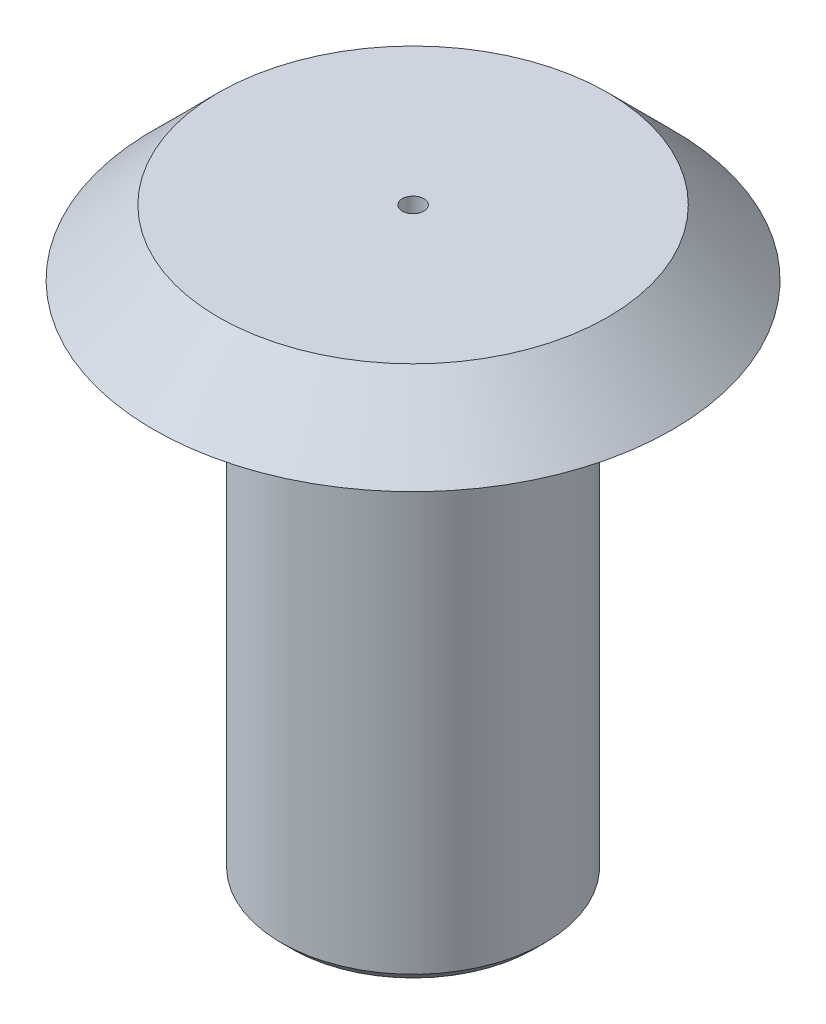
ISO-10303-21;
HEADER;
FILE_DESCRIPTION(('STEP AP214'),'2;1');
FILE_NAME('part.step','',(''),(''),'','','');
FILE_SCHEMA(('AUTOMOTIVE_DESIGN { 1 0 10303 214 1 1 1 1 }'));
ENDSEC;
DATA;
#1=APPLICATION_CONTEXT('core data for automotive mechanical design processes');
#2=APPLICATION_PROTOCOL_DEFINITION('international standard','automotive_design',2000,#1);
#3=PRODUCT_CONTEXT('',#1,'mechanical');
#4=PRODUCT('Part','Part','',(#3));
#5=PRODUCT_RELATED_PRODUCT_CATEGORY('part','',(#4));
#6=PRODUCT_DEFINITION_FORMATION('','',#4);
#7=PRODUCT_DEFINITION_CONTEXT('part definition',#1,'design');
#8=PRODUCT_DEFINITION('design','',#6,#7);
#9=PRODUCT_DEFINITION_SHAPE('','',#8);
#10=(LENGTH_UNIT() NAMED_UNIT(*) SI_UNIT(.MILLI.,.METRE.));
#11=(NAMED_UNIT(*) PLANE_ANGLE_UNIT() SI_UNIT($,.RADIAN.));
#12=(NAMED_UNIT(*) SI_UNIT($,.STERADIAN.) SOLID_ANGLE_UNIT());
#13=UNCERTAINTY_MEASURE_WITH_UNIT(LENGTH_MEASURE(1.E-05),#10,'distance_accuracy_value','');
#14=(GEOMETRIC_REPRESENTATION_CONTEXT(3) GLOBAL_UNCERTAINTY_ASSIGNED_CONTEXT((#13)) GLOBAL_UNIT_ASSIGNED_CONTEXT((#10,
#11,#12)) REPRESENTATION_CONTEXT('',''));
#15=CARTESIAN_POINT('',(0.,0.,0.));
#16=DIRECTION('',(0.,0.,1.));
#17=DIRECTION('',(1.,0.,0.));
#18=AXIS2_PLACEMENT_3D('',#15,#16,#17);
#19=CARTESIAN_POINT('',(12.,0.,0.));
#20=DIRECTION('',(0.,-1.,0.));
#21=DIRECTION('',(1.,0.,0.));
#22=AXIS2_PLACEMENT_3D('',#19,#20,#21);
#23=PLANE('',#22);
#24=CARTESIAN_POINT('',(0.,0.,0.));
#25=DIRECTION('',(0.,-1.,0.));
#26=DIRECTION('',(1.,0.,0.));
#27=AXIS2_PLACEMENT_3D('',#24,#25,#26);
#28=CIRCLE('',#27,12.);
#29=CARTESIAN_POINT('',(12.,0.,0.));
#30=VERTEX_POINT('',#29);
#31=EDGE_CURVE('E102',#30,#30,#28,.T.);
#32=ORIENTED_EDGE('',*,*,#31,.T.);
#33=EDGE_LOOP('',(#32));
#34=FACE_BOUND('',#33,.T.);
#35=CARTESIAN_POINT('',(0.,0.,0.));
#36=DIRECTION('',(0.,-1.,0.));
#37=DIRECTION('',(1.,0.,0.));
#38=AXIS2_PLACEMENT_3D('',#35,#36,#37);
#39=CIRCLE('',#38,9.);
#40=CARTESIAN_POINT('',(9.,0.,0.));
#41=VERTEX_POINT('',#40);
#42=EDGE_CURVE('E66',#41,#41,#39,.T.);
#43=ORIENTED_EDGE('',*,*,#42,.F.);
#44=EDGE_LOOP('',(#43));
#45=FACE_BOUND('',#44,.T.);
#46=ADVANCED_FACE('F39',(#34,#45),#23,.T.);
#47=CARTESIAN_POINT('',(0.,1.,0.));
#48=DIRECTION('',(0.,-1.,0.));
#49=DIRECTION('',(1.,0.,0.));
#50=AXIS2_PLACEMENT_3D('',#47,#48,#49);
#51=CONICAL_SURFACE('',#50,7.99999999999999,0.785398163397452);
#52=ORIENTED_EDGE('',*,*,#42,.T.);
#53=EDGE_LOOP('',(#52));
#54=FACE_BOUND('',#53,.T.);
#55=CARTESIAN_POINT('',(0.,1.,0.));
#56=DIRECTION('',(0.,-1.,0.));
#57=DIRECTION('',(1.,0.,0.));
#58=AXIS2_PLACEMENT_3D('',#55,#56,#57);
#59=CIRCLE('',#58,7.99999999999999);
#60=CARTESIAN_POINT('',(7.99999999999999,1.00000000000003,0.));
#61=VERTEX_POINT('',#60);
#62=EDGE_CURVE('E69',#61,#61,#59,.T.);
#63=ORIENTED_EDGE('',*,*,#62,.F.);
#64=EDGE_LOOP('',(#63));
#65=FACE_BOUND('',#64,.T.);
#66=ADVANCED_FACE('F126',(#54,#65),#51,.F.);
#67=CARTESIAN_POINT('',(7.99999999999999,1.,0.));
#68=DIRECTION('',(0.,-1.,0.));
#69=DIRECTION('',(1.,0.,0.));
#70=AXIS2_PLACEMENT_3D('',#67,#68,#69);
#71=PLANE('',#70);
#72=CARTESIAN_POINT('',(0.,0.999999999999977,0.));
#73=DIRECTION('',(0.,-1.,0.));
#74=DIRECTION('',(1.,0.,0.));
#75=AXIS2_PLACEMENT_3D('',#72,#73,#74);
#76=CIRCLE('',#75,6.59999999999994);
#77=CARTESIAN_POINT('',(6.59999999999994,0.999999999999999,0.));
#78=VERTEX_POINT('',#77);
#79=EDGE_CURVE('E10',#78,#78,#76,.F.);
#80=ORIENTED_EDGE('',*,*,#79,.T.);
#81=EDGE_LOOP('',(#80));
#82=FACE_BOUND('',#81,.T.);
#83=ORIENTED_EDGE('',*,*,#62,.T.);
#84=EDGE_LOOP('',(#83));
#85=FACE_BOUND('',#84,.T.);
#86=ADVANCED_FACE('F131',(#82,#85),#71,.T.);
#87=CARTESIAN_POINT('',(2.56415325894486E-12,-747.512282571255,0.));
#88=DIRECTION('',(0.,-1.,0.));
#89=DIRECTION('',(1.,0.,0.));
#90=AXIS2_PLACEMENT_3D('',#87,#88,#89);
#91=CYLINDRICAL_SURFACE('',#90,6.09999999999996);
#92=CARTESIAN_POINT('',(0.,-23.5,0.));
#93=DIRECTION('',(0.,-1.,0.));
#94=DIRECTION('',(1.,0.,0.));
#95=AXIS2_PLACEMENT_3D('',#92,#93,#94);
#96=CIRCLE('',#95,6.09999999999996);
#97=CARTESIAN_POINT('',(6.10000000000004,-23.4999999999999,0.));
#98=VERTEX_POINT('',#97);
#99=EDGE_CURVE('E47',#98,#98,#96,.F.);
#100=ORIENTED_EDGE('',*,*,#99,.T.);
#101=EDGE_LOOP('',(#100));
#102=FACE_BOUND('',#101,.T.);
#103=CARTESIAN_POINT('',(0.,0.499999999999945,0.));
#104=DIRECTION('',(0.,-1.,0.));
#105=DIRECTION('',(1.,0.,0.));
#106=AXIS2_PLACEMENT_3D('',#103,#104,#105);
#107=CIRCLE('',#106,6.09999999999996);
#108=CARTESIAN_POINT('',(6.09999999999996,0.499999999999966,0.));
#109=VERTEX_POINT('',#108);
#110=EDGE_CURVE('E51',#109,#109,#107,.T.);
#111=ORIENTED_EDGE('',*,*,#110,.T.);
#112=EDGE_LOOP('',(#111));
#113=FACE_BOUND('',#112,.T.);
#114=ADVANCED_FACE('F153',(#102,#113),#91,.T.);
#115=CARTESIAN_POINT('',(6.1,-24.,0.));
#116=DIRECTION('',(0.,-1.,0.));
#117=DIRECTION('',(1.,0.,0.));
#118=AXIS2_PLACEMENT_3D('',#115,#116,#117);
#119=PLANE('',#118);
#120=CARTESIAN_POINT('',(0.,-24.,0.));
#121=DIRECTION('',(0.,-1.,0.));
#122=DIRECTION('',(1.,0.,0.));
#123=AXIS2_PLACEMENT_3D('',#120,#121,#122);
#124=CIRCLE('',#123,1.49999999999996);
#125=CARTESIAN_POINT('',(1.50000000000004,-24.,0.));
#126=VERTEX_POINT('',#125);
#127=EDGE_CURVE('E55',#126,#126,#124,.F.);
#128=ORIENTED_EDGE('',*,*,#127,.T.);
#129=EDGE_LOOP('',(#128));
#130=FACE_BOUND('',#129,.T.);
#131=CARTESIAN_POINT('',(0.,-24.,0.));
#132=DIRECTION('',(0.,-1.,0.));
#133=DIRECTION('',(1.,0.,0.));
#134=AXIS2_PLACEMENT_3D('',#131,#132,#133);
#135=CIRCLE('',#134,5.59999999999999);
#136=CARTESIAN_POINT('',(5.60000000000007,-24.,0.));
#137=VERTEX_POINT('',#136);
#138=EDGE_CURVE('E60',#137,#137,#135,.T.);
#139=ORIENTED_EDGE('',*,*,#138,.T.);
#140=EDGE_LOOP('',(#139));
#141=FACE_BOUND('',#140,.T.);
#142=ADVANCED_FACE('F150',(#130,#141),#119,.T.);
#143=CARTESIAN_POINT('',(2.56415325894486E-12,-747.512282571255,0.));
#144=DIRECTION('',(0.,-1.,0.));
#145=DIRECTION('',(1.,0.,0.));
#146=AXIS2_PLACEMENT_3D('',#143,#144,#145);
#147=CYLINDRICAL_SURFACE('',#146,0.999999999999919);
#148=CARTESIAN_POINT('',(0.,-23.5,0.));
#149=DIRECTION('',(0.,-1.,0.));
#150=DIRECTION('',(1.,0.,0.));
#151=AXIS2_PLACEMENT_3D('',#148,#149,#150);
#152=CIRCLE('',#151,0.999999999999919);
#153=CARTESIAN_POINT('',(1.,-23.5,0.));
#154=VERTEX_POINT('',#153);
#155=EDGE_CURVE('E63',#154,#154,#152,.T.);
#156=ORIENTED_EDGE('',*,*,#155,.T.);
#157=EDGE_LOOP('',(#156));
#158=FACE_BOUND('',#157,.T.);
#159=CARTESIAN_POINT('',(0.,-23.1180339887465,0.));
#160=DIRECTION('',(0.,-1.,0.));
#161=DIRECTION('',(1.,0.,0.));
#162=AXIS2_PLACEMENT_3D('',#159,#160,#161);
#163=CIRCLE('',#162,0.99999999999992);
#164=CARTESIAN_POINT('',(1.,-23.1180339887465,0.));
#165=VERTEX_POINT('',#164);
#166=EDGE_CURVE('E72',#165,#165,#163,.T.);
#167=ORIENTED_EDGE('',*,*,#166,.F.);
#168=EDGE_LOOP('',(#167));
#169=FACE_BOUND('',#168,.T.);
#170=ADVANCED_FACE('F152',(#158,#169),#147,.F.);
#171=CARTESIAN_POINT('',(0.,-23.1180339887465,0.));
#172=DIRECTION('',(0.,-1.,0.));
#173=DIRECTION('',(1.,0.,0.));
#174=AXIS2_PLACEMENT_3D('',#171,#172,#173);
#175=SPHERICAL_SURFACE('',#174,1.);
#176=ORIENTED_EDGE('',*,*,#166,.T.);
#177=EDGE_LOOP('',(#176));
#178=FACE_BOUND('',#177,.T.);
#179=CARTESIAN_POINT('',(0.,-22.3726779962475,0.));
#180=DIRECTION('',(0.,-1.,0.));
#181=DIRECTION('',(1.,0.,0.));
#182=AXIS2_PLACEMENT_3D('',#179,#180,#181);
#183=CIRCLE('',#182,0.666666666667726);
#184=CARTESIAN_POINT('',(0.666666666667803,-22.3726779962475,0.));
#185=VERTEX_POINT('',#184);
#186=EDGE_CURVE('E75',#185,#185,#183,.T.);
#187=ORIENTED_EDGE('',*,*,#186,.F.);
#188=EDGE_LOOP('',(#187));
#189=FACE_BOUND('',#188,.T.);
#190=ADVANCED_FACE('F160',(#178,#189),#175,.F.);
#191=CARTESIAN_POINT('',(0.,-22.,0.));
#192=DIRECTION('',(0.,-1.,0.));
#193=DIRECTION('',(1.,0.,0.));
#194=AXIS2_PLACEMENT_3D('',#191,#192,#193);
#195=TOROIDAL_SURFACE('',#194,0.999999999999925,0.499999999997444);
#196=ORIENTED_EDGE('',*,*,#186,.T.);
#197=EDGE_LOOP('',(#196));
#198=FACE_BOUND('',#197,.T.);
#199=CARTESIAN_POINT('',(0.,-21.6273220037524,0.));
#200=DIRECTION('',(0.,-1.,0.));
#201=DIRECTION('',(1.,0.,0.));
#202=AXIS2_PLACEMENT_3D('',#199,#200,#201);
#203=CIRCLE('',#202,0.666666666667729);
#204=CARTESIAN_POINT('',(0.666666666667803,-21.6273220037524,0.));
#205=VERTEX_POINT('',#204);
#206=EDGE_CURVE('E78',#205,#205,#203,.T.);
#207=ORIENTED_EDGE('',*,*,#206,.F.);
#208=EDGE_LOOP('',(#207));
#209=FACE_BOUND('',#208,.T.);
#210=ADVANCED_FACE('F196',(#198,#209),#195,.T.);
#211=CARTESIAN_POINT('',(0.,-20.8819660112535,0.));
#212=DIRECTION('',(0.,-1.,0.));
#213=DIRECTION('',(1.,0.,0.));
#214=AXIS2_PLACEMENT_3D('',#211,#212,#213);
#215=SPHERICAL_SURFACE('',#214,1.);
#216=ORIENTED_EDGE('',*,*,#206,.T.);
#217=EDGE_LOOP('',(#216));
#218=FACE_BOUND('',#217,.T.);
#219=CARTESIAN_POINT('',(0.,-20.8819660112536,0.));
#220=DIRECTION('',(0.,-1.,0.));
#221=DIRECTION('',(1.,0.,0.));
#222=AXIS2_PLACEMENT_3D('',#219,#220,#221);
#223=CIRCLE('',#222,0.999999999999928);
#224=CARTESIAN_POINT('',(1.,-20.8819660112536,0.));
#225=VERTEX_POINT('',#224);
#226=EDGE_CURVE('E81',#225,#225,#223,.T.);
#227=ORIENTED_EDGE('',*,*,#226,.F.);
#228=EDGE_LOOP('',(#227));
#229=FACE_BOUND('',#228,.T.);
#230=ADVANCED_FACE('F205',(#218,#229),#215,.F.);
#231=CARTESIAN_POINT('',(2.56415325894486E-12,-747.512282571255,0.));
#232=DIRECTION('',(0.,-1.,0.));
#233=DIRECTION('',(1.,0.,0.));
#234=AXIS2_PLACEMENT_3D('',#231,#232,#233);
#235=CYLINDRICAL_SURFACE('',#234,1.00000000000042);
#236=ORIENTED_EDGE('',*,*,#226,.T.);
#237=EDGE_LOOP('',(#236));
#238=FACE_BOUND('',#237,.T.);
#239=CARTESIAN_POINT('',(0.,1.18933982822278,0.));
#240=DIRECTION('',(0.,-1.,0.));
#241=DIRECTION('',(1.,0.,0.));
#242=AXIS2_PLACEMENT_3D('',#239,#240,#241);
#243=CIRCLE('',#242,1.00000000000091);
#244=CARTESIAN_POINT('',(1.00000000000091,1.18933982822278,0.));
#245=VERTEX_POINT('',#244);
#246=EDGE_CURVE('E84',#245,#245,#243,.T.);
#247=ORIENTED_EDGE('',*,*,#246,.F.);
#248=EDGE_LOOP('',(#247));
#249=FACE_BOUND('',#248,.T.);
#250=ADVANCED_FACE('F215',(#238,#249),#235,.F.);
#251=CARTESIAN_POINT('',(0.,1.18933982822018,0.));
#252=DIRECTION('',(0.,-1.,0.));
#253=DIRECTION('',(1.,0.,0.));
#254=AXIS2_PLACEMENT_3D('',#251,#252,#253);
#255=DEGENERATE_TOROIDAL_SURFACE('',#254,0.250000000000004,0.750000000000907,.T.);
#256=ORIENTED_EDGE('',*,*,#246,.T.);
#257=EDGE_LOOP('',(#256));
#258=FACE_BOUND('',#257,.T.);
#259=CARTESIAN_POINT('',(0.,1.71966991411265,0.));
#260=DIRECTION('',(0.,-1.,0.));
#261=DIRECTION('',(1.,0.,0.));
#262=AXIS2_PLACEMENT_3D('',#259,#260,#261);
#263=CIRCLE('',#262,0.780330085889914);
#264=CARTESIAN_POINT('',(0.780330085889908,1.71966991411266,0.));
#265=VERTEX_POINT('',#264);
#266=EDGE_CURVE('E87',#265,#265,#263,.T.);
#267=ORIENTED_EDGE('',*,*,#266,.F.);
#268=EDGE_LOOP('',(#267));
#269=FACE_BOUND('',#268,.T.);
#270=ADVANCED_FACE('F225',(#258,#269),#255,.F.);
#271=CARTESIAN_POINT('',(0.,1.78033008589018,0.));
#272=DIRECTION('',(0.,-1.,0.));
#273=DIRECTION('',(1.,0.,0.));
#274=AXIS2_PLACEMENT_3D('',#271,#272,#273);
#275=CONICAL_SURFACE('',#274,0.719669914112928,0.785398163392993);
#276=ORIENTED_EDGE('',*,*,#266,.T.);
#277=EDGE_LOOP('',(#276));
#278=FACE_BOUND('',#277,.T.);
#279=CARTESIAN_POINT('',(0.,1.78033008589018,0.));
#280=DIRECTION('',(0.,-1.,0.));
#281=DIRECTION('',(1.,0.,0.));
#282=AXIS2_PLACEMENT_3D('',#279,#280,#281);
#283=CIRCLE('',#282,0.719669914112928);
#284=CARTESIAN_POINT('',(0.719669914112922,1.78033008589018,0.));
#285=VERTEX_POINT('',#284);
#286=EDGE_CURVE('E90',#285,#285,#283,.T.);
#287=ORIENTED_EDGE('',*,*,#286,.F.);
#288=EDGE_LOOP('',(#287));
#289=FACE_BOUND('',#288,.T.);
#290=ADVANCED_FACE('F235',(#278,#289),#275,.F.);
#291=CARTESIAN_POINT('',(0.,2.31066017177982,0.));
#292=DIRECTION('',(0.,-1.,0.));
#293=DIRECTION('',(1.,0.,0.));
#294=AXIS2_PLACEMENT_3D('',#291,#292,#293);
#295=TOROIDAL_SURFACE('',#294,1.25000000000001,0.749999999997811);
#296=ORIENTED_EDGE('',*,*,#286,.T.);
#297=EDGE_LOOP('',(#296));
#298=FACE_BOUND('',#297,.T.);
#299=CARTESIAN_POINT('',(0.,2.31066017177983,0.));
#300=DIRECTION('',(0.,-1.,0.));
#301=DIRECTION('',(1.,0.,0.));
#302=AXIS2_PLACEMENT_3D('',#299,#300,#301);
#303=CIRCLE('',#302,0.500000000002572);
#304=CARTESIAN_POINT('',(0.500000000002564,2.31066017177983,0.));
#305=VERTEX_POINT('',#304);
#306=EDGE_CURVE('E93',#305,#305,#303,.T.);
#307=ORIENTED_EDGE('',*,*,#306,.F.);
#308=EDGE_LOOP('',(#307));
#309=FACE_BOUND('',#308,.T.);
#310=ADVANCED_FACE('F245',(#298,#309),#295,.T.);
#311=CARTESIAN_POINT('',(2.56415325894486E-12,-747.512282571255,0.));
#312=DIRECTION('',(0.,-1.,0.));
#313=DIRECTION('',(1.,0.,0.));
#314=AXIS2_PLACEMENT_3D('',#311,#312,#313);
#315=CYLINDRICAL_SURFACE('',#314,0.500000000001291);
#316=ORIENTED_EDGE('',*,*,#306,.T.);
#317=EDGE_LOOP('',(#316));
#318=FACE_BOUND('',#317,.T.);
#319=CARTESIAN_POINT('',(0.,3.,0.));
#320=DIRECTION('',(0.,-1.,0.));
#321=DIRECTION('',(1.,0.,0.));
#322=AXIS2_PLACEMENT_3D('',#319,#320,#321);
#323=CIRCLE('',#322,0.50000000000001);
#324=CARTESIAN_POINT('',(0.5,3.,0.));
#325=VERTEX_POINT('',#324);
#326=EDGE_CURVE('E96',#325,#325,#323,.T.);
#327=ORIENTED_EDGE('',*,*,#326,.F.);
#328=EDGE_LOOP('',(#327));
#329=FACE_BOUND('',#328,.T.);
#330=ADVANCED_FACE('F122',(#318,#329),#315,.F.);
#331=CARTESIAN_POINT('',(1.,2.99999999999999,0.));
#332=DIRECTION('',(0.,1.,0.));
#333=DIRECTION('',(-1.,0.,0.));
#334=AXIS2_PLACEMENT_3D('',#331,#332,#333);
#335=PLANE('',#334);
#336=ORIENTED_EDGE('',*,*,#326,.T.);
#337=EDGE_LOOP('',(#336));
#338=FACE_BOUND('',#337,.T.);
#339=CARTESIAN_POINT('',(0.,3.,0.));
#340=DIRECTION('',(0.,-1.,0.));
#341=DIRECTION('',(1.,0.,0.));
#342=AXIS2_PLACEMENT_3D('',#339,#340,#341);
#343=CIRCLE('',#342,8.99999999999998);
#344=CARTESIAN_POINT('',(8.99999999999997,3.00000000000003,0.));
#345=VERTEX_POINT('',#344);
#346=EDGE_CURVE('E99',#345,#345,#343,.T.);
#347=ORIENTED_EDGE('',*,*,#346,.F.);
#348=EDGE_LOOP('',(#347));
#349=FACE_BOUND('',#348,.T.);
#350=ADVANCED_FACE('F111',(#338,#349),#335,.T.);
#351=CARTESIAN_POINT('',(0.,0.,0.));
#352=DIRECTION('',(0.,-1.,0.));
#353=DIRECTION('',(1.,0.,0.));
#354=AXIS2_PLACEMENT_3D('',#351,#352,#353);
#355=CONICAL_SURFACE('',#354,12.,0.785398163397451);
#356=ORIENTED_EDGE('',*,*,#346,.T.);
#357=EDGE_LOOP('',(#356));
#358=FACE_BOUND('',#357,.T.);
#359=ORIENTED_EDGE('',*,*,#31,.F.);
#360=EDGE_LOOP('',(#359));
#361=FACE_BOUND('',#360,.T.);
#362=ADVANCED_FACE('F108',(#358,#361),#355,.T.);
#363=CARTESIAN_POINT('',(0.,-23.5,0.));
#364=DIRECTION('',(0.,-1.,0.));
#365=DIRECTION('',(1.,0.,0.));
#366=AXIS2_PLACEMENT_3D('',#363,#364,#365);
#367=CONICAL_SURFACE('',#366,0.999999999999919,0.785398163397445);
#368=ORIENTED_EDGE('',*,*,#127,.F.);
#369=EDGE_LOOP('',(#368));
#370=FACE_BOUND('',#369,.T.);
#371=ORIENTED_EDGE('',*,*,#155,.F.);
#372=EDGE_LOOP('',(#371));
#373=FACE_BOUND('',#372,.T.);
#374=ADVANCED_FACE('F110',(#370,#373),#367,.F.);
#375=CARTESIAN_POINT('',(0.,-24.,0.));
#376=DIRECTION('',(0.,1.,0.));
#377=DIRECTION('',(-1.,0.,0.));
#378=AXIS2_PLACEMENT_3D('',#375,#376,#377);
#379=CONICAL_SURFACE('',#378,5.59999999999997,0.785398163397379);
#380=ORIENTED_EDGE('',*,*,#99,.F.);
#381=EDGE_LOOP('',(#380));
#382=FACE_BOUND('',#381,.T.);
#383=ORIENTED_EDGE('',*,*,#138,.F.);
#384=EDGE_LOOP('',(#383));
#385=FACE_BOUND('',#384,.T.);
#386=ADVANCED_FACE('F119',(#382,#385),#379,.T.);
#387=CARTESIAN_POINT('',(0.,0.499999999999945,0.));
#388=DIRECTION('',(0.,1.,0.));
#389=DIRECTION('',(-1.,0.,0.));
#390=AXIS2_PLACEMENT_3D('',#387,#388,#389);
#391=CONICAL_SURFACE('',#390,6.09999999999996,0.785398163397396);
#392=ORIENTED_EDGE('',*,*,#79,.F.);
#393=EDGE_LOOP('',(#392));
#394=FACE_BOUND('',#393,.T.);
#395=ORIENTED_EDGE('',*,*,#110,.F.);
#396=EDGE_LOOP('',(#395));
#397=FACE_BOUND('',#396,.T.);
#398=ADVANCED_FACE('F42',(#394,#397),#391,.T.);
#399=CLOSED_SHELL('',(#46,#66,#86,#114,#142,#170,#190,#210,#230,#250,#270,#290,#310,#330,#350,
#362,#374,#386,#398));
#400=MANIFOLD_SOLID_BREP('B2',#399);
#401=ADVANCED_BREP_SHAPE_REPRESENTATION('',(#18,#400),#14);
#402=SHAPE_DEFINITION_REPRESENTATION(#9,#401);
ENDSEC;
END-ISO-10303-21;
